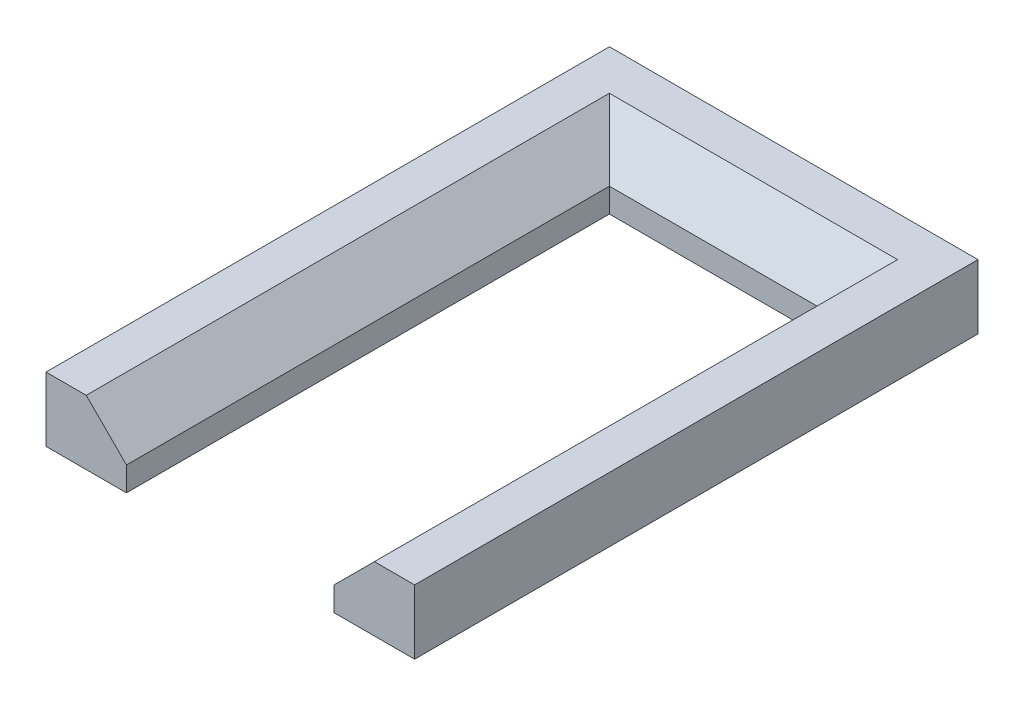
ISO-10303-21;
HEADER;
FILE_DESCRIPTION(('STEP AP214'),'2;1');
FILE_NAME('part.step','',(''),(''),'','','');
FILE_SCHEMA(('AUTOMOTIVE_DESIGN { 1 0 10303 214 1 1 1 1 }'));
ENDSEC;
DATA;
#1=APPLICATION_CONTEXT('core data for automotive mechanical design processes');
#2=APPLICATION_PROTOCOL_DEFINITION('international standard','automotive_design',2000,#1);
#3=PRODUCT_CONTEXT('',#1,'mechanical');
#4=PRODUCT('Part','Part','',(#3));
#5=PRODUCT_RELATED_PRODUCT_CATEGORY('part','',(#4));
#6=PRODUCT_DEFINITION_FORMATION('','',#4);
#7=PRODUCT_DEFINITION_CONTEXT('part definition',#1,'design');
#8=PRODUCT_DEFINITION('design','',#6,#7);
#9=PRODUCT_DEFINITION_SHAPE('','',#8);
#10=(LENGTH_UNIT() NAMED_UNIT(*) SI_UNIT(.MILLI.,.METRE.));
#11=(NAMED_UNIT(*) PLANE_ANGLE_UNIT() SI_UNIT($,.RADIAN.));
#12=(NAMED_UNIT(*) SI_UNIT($,.STERADIAN.) SOLID_ANGLE_UNIT());
#13=UNCERTAINTY_MEASURE_WITH_UNIT(LENGTH_MEASURE(1.E-05),#10,'distance_accuracy_value','');
#14=(GEOMETRIC_REPRESENTATION_CONTEXT(3) GLOBAL_UNCERTAINTY_ASSIGNED_CONTEXT((#13)) GLOBAL_UNIT_ASSIGNED_CONTEXT((#10,
#11,#12)) REPRESENTATION_CONTEXT('',''));
#15=CARTESIAN_POINT('',(0.,0.,0.));
#16=DIRECTION('',(0.,0.,1.));
#17=DIRECTION('',(1.,0.,0.));
#18=AXIS2_PLACEMENT_3D('',#15,#16,#17);
#19=CARTESIAN_POINT('',(-22.9,8.,-70.));
#20=DIRECTION('',(1.,0.,0.));
#21=DIRECTION('',(0.,0.,-1.));
#22=AXIS2_PLACEMENT_3D('',#19,#20,#21);
#23=PLANE('',#22);
#24=DIRECTION('',(0.,0.,1.));
#25=VECTOR('',#24,1.);
#26=CARTESIAN_POINT('',(-22.9,0.,-70.));
#27=LINE('',#26,#25);
#28=CARTESIAN_POINT('',(-22.9,0.,-70.));
#29=VERTEX_POINT('',#28);
#30=CARTESIAN_POINT('',(-22.9,0.,0.));
#31=VERTEX_POINT('',#30);
#32=EDGE_CURVE('E139',#29,#31,#27,.T.);
#33=ORIENTED_EDGE('',*,*,#32,.T.);
#34=DIRECTION('',(0.,-1.,0.));
#35=VECTOR('',#34,1.);
#36=CARTESIAN_POINT('',(-22.9,8.,0.));
#37=LINE('',#36,#35);
#38=CARTESIAN_POINT('',(-22.9,8.,0.));
#39=VERTEX_POINT('',#38);
#40=EDGE_CURVE('E119',#39,#31,#37,.T.);
#41=ORIENTED_EDGE('',*,*,#40,.F.);
#42=DIRECTION('',(0.,0.,1.));
#43=VECTOR('',#42,1.);
#44=CARTESIAN_POINT('',(-22.9,8.,-70.));
#45=LINE('',#44,#43);
#46=CARTESIAN_POINT('',(-22.9,8.,-70.));
#47=VERTEX_POINT('',#46);
#48=EDGE_CURVE('E127',#47,#39,#45,.T.);
#49=ORIENTED_EDGE('',*,*,#48,.F.);
#50=DIRECTION('',(0.,-1.,0.));
#51=VECTOR('',#50,1.);
#52=CARTESIAN_POINT('',(-22.9,8.,-70.));
#53=LINE('',#52,#51);
#54=EDGE_CURVE('E186',#47,#29,#53,.T.);
#55=ORIENTED_EDGE('',*,*,#54,.T.);
#56=EDGE_LOOP('',(#33,#41,#49,#55));
#57=FACE_BOUND('',#56,.T.);
#58=ADVANCED_FACE('F35',(#57),#23,.F.);
#59=CARTESIAN_POINT('',(-22.9,8.,0.));
#60=DIRECTION('',(0.,0.,-1.));
#61=DIRECTION('',(-1.,0.,0.));
#62=AXIS2_PLACEMENT_3D('',#59,#60,#61);
#63=PLANE('',#62);
#64=DIRECTION('',(0.,-1.,0.));
#65=VECTOR('',#64,1.);
#66=CARTESIAN_POINT('',(-12.9,8.,0.));
#67=LINE('',#66,#65);
#68=CARTESIAN_POINT('',(-12.9,2.99999999999999,0.));
#69=VERTEX_POINT('',#68);
#70=CARTESIAN_POINT('',(-12.9,0.,0.));
#71=VERTEX_POINT('',#70);
#72=EDGE_CURVE('E141',#69,#71,#67,.T.);
#73=ORIENTED_EDGE('',*,*,#72,.F.);
#74=DIRECTION('',(-0.707106781186546,0.707106781186549,0.));
#75=VECTOR('',#74,1.);
#76=CARTESIAN_POINT('',(-17.9,8.,0.));
#77=LINE('',#76,#75);
#78=CARTESIAN_POINT('',(-17.9,8.,0.));
#79=VERTEX_POINT('',#78);
#80=EDGE_CURVE('E122',#69,#79,#77,.T.);
#81=ORIENTED_EDGE('',*,*,#80,.T.);
#82=DIRECTION('',(1.,0.,0.));
#83=VECTOR('',#82,1.);
#84=CARTESIAN_POINT('',(-22.9,8.,0.));
#85=LINE('',#84,#83);
#86=EDGE_CURVE('E113',#39,#79,#85,.T.);
#87=ORIENTED_EDGE('',*,*,#86,.F.);
#88=ORIENTED_EDGE('',*,*,#40,.T.);
#89=DIRECTION('',(1.,0.,0.));
#90=VECTOR('',#89,1.);
#91=CARTESIAN_POINT('',(-22.9,0.,0.));
#92=LINE('',#91,#90);
#93=EDGE_CURVE('E166',#31,#71,#92,.T.);
#94=ORIENTED_EDGE('',*,*,#93,.T.);
#95=EDGE_LOOP('',(#73,#81,#87,#88,#94));
#96=FACE_BOUND('',#95,.T.);
#97=ADVANCED_FACE('F116',(#96),#63,.F.);
#98=CARTESIAN_POINT('',(-12.9,8.,0.));
#99=DIRECTION('',(-1.,0.,0.));
#100=DIRECTION('',(0.,0.,1.));
#101=AXIS2_PLACEMENT_3D('',#98,#99,#100);
#102=PLANE('',#101);
#103=DIRECTION('',(0.,-1.,0.));
#104=VECTOR('',#103,1.);
#105=CARTESIAN_POINT('',(-12.9,8.,-60.));
#106=LINE('',#105,#104);
#107=CARTESIAN_POINT('',(-12.9,2.99999999999999,-60.));
#108=VERTEX_POINT('',#107);
#109=CARTESIAN_POINT('',(-12.9,0.,-60.));
#110=VERTEX_POINT('',#109);
#111=EDGE_CURVE('E145',#108,#110,#106,.T.);
#112=ORIENTED_EDGE('',*,*,#111,.F.);
#113=DIRECTION('',(0.,0.,1.));
#114=VECTOR('',#113,1.);
#115=CARTESIAN_POINT('',(-12.9,2.99999999999999,0.));
#116=LINE('',#115,#114);
#117=EDGE_CURVE('E152',#108,#69,#116,.T.);
#118=ORIENTED_EDGE('',*,*,#117,.T.);
#119=ORIENTED_EDGE('',*,*,#72,.T.);
#120=DIRECTION('',(0.,0.,-1.));
#121=VECTOR('',#120,1.);
#122=CARTESIAN_POINT('',(-12.9,0.,0.));
#123=LINE('',#122,#121);
#124=EDGE_CURVE('E168',#71,#110,#123,.T.);
#125=ORIENTED_EDGE('',*,*,#124,.T.);
#126=EDGE_LOOP('',(#112,#118,#119,#125));
#127=FACE_BOUND('',#126,.T.);
#128=ADVANCED_FACE('F204',(#127),#102,.F.);
#129=CARTESIAN_POINT('',(-12.9,8.,-60.));
#130=DIRECTION('',(0.,0.,-1.));
#131=DIRECTION('',(-1.,0.,0.));
#132=AXIS2_PLACEMENT_3D('',#129,#130,#131);
#133=PLANE('',#132);
#134=DIRECTION('',(0.,-1.,0.));
#135=VECTOR('',#134,1.);
#136=CARTESIAN_POINT('',(12.9,8.,-60.));
#137=LINE('',#136,#135);
#138=CARTESIAN_POINT('',(12.9,2.99999999999999,-60.));
#139=VERTEX_POINT('',#138);
#140=CARTESIAN_POINT('',(12.9,0.,-60.));
#141=VERTEX_POINT('',#140);
#142=EDGE_CURVE('E196',#139,#141,#137,.T.);
#143=ORIENTED_EDGE('',*,*,#142,.F.);
#144=DIRECTION('',(-1.,0.,0.));
#145=VECTOR('',#144,1.);
#146=CARTESIAN_POINT('',(-12.9,2.99999999999999,-60.));
#147=LINE('',#146,#145);
#148=EDGE_CURVE('E155',#139,#108,#147,.T.);
#149=ORIENTED_EDGE('',*,*,#148,.T.);
#150=ORIENTED_EDGE('',*,*,#111,.T.);
#151=DIRECTION('',(1.,0.,0.));
#152=VECTOR('',#151,1.);
#153=CARTESIAN_POINT('',(-12.9,0.,-60.));
#154=LINE('',#153,#152);
#155=EDGE_CURVE('E175',#110,#141,#154,.T.);
#156=ORIENTED_EDGE('',*,*,#155,.T.);
#157=EDGE_LOOP('',(#143,#149,#150,#156));
#158=FACE_BOUND('',#157,.T.);
#159=ADVANCED_FACE('F199',(#158),#133,.F.);
#160=CARTESIAN_POINT('',(12.9,8.,-60.));
#161=DIRECTION('',(1.,0.,0.));
#162=DIRECTION('',(0.,0.,-1.));
#163=AXIS2_PLACEMENT_3D('',#160,#161,#162);
#164=PLANE('',#163);
#165=DIRECTION('',(0.,-1.,0.));
#166=VECTOR('',#165,1.);
#167=CARTESIAN_POINT('',(12.9,8.,0.));
#168=LINE('',#167,#166);
#169=CARTESIAN_POINT('',(12.9,2.99999999999999,0.));
#170=VERTEX_POINT('',#169);
#171=CARTESIAN_POINT('',(12.9,0.,0.));
#172=VERTEX_POINT('',#171);
#173=EDGE_CURVE('E194',#170,#172,#168,.T.);
#174=ORIENTED_EDGE('',*,*,#173,.F.);
#175=DIRECTION('',(0.,0.,-1.));
#176=VECTOR('',#175,1.);
#177=CARTESIAN_POINT('',(12.9,2.99999999999999,-60.));
#178=LINE('',#177,#176);
#179=EDGE_CURVE('E11',#170,#139,#178,.T.);
#180=ORIENTED_EDGE('',*,*,#179,.T.);
#181=ORIENTED_EDGE('',*,*,#142,.T.);
#182=DIRECTION('',(0.,0.,1.));
#183=VECTOR('',#182,1.);
#184=CARTESIAN_POINT('',(12.9,0.,-60.));
#185=LINE('',#184,#183);
#186=EDGE_CURVE('E178',#141,#172,#185,.T.);
#187=ORIENTED_EDGE('',*,*,#186,.T.);
#188=EDGE_LOOP('',(#174,#180,#181,#187));
#189=FACE_BOUND('',#188,.T.);
#190=ADVANCED_FACE('F209',(#189),#164,.F.);
#191=CARTESIAN_POINT('',(12.9,8.,0.));
#192=DIRECTION('',(0.,0.,-1.));
#193=DIRECTION('',(-1.,0.,0.));
#194=AXIS2_PLACEMENT_3D('',#191,#192,#193);
#195=PLANE('',#194);
#196=DIRECTION('',(1.,0.,0.));
#197=VECTOR('',#196,1.);
#198=CARTESIAN_POINT('',(12.9,8.,0.));
#199=LINE('',#198,#197);
#200=CARTESIAN_POINT('',(17.9,8.,0.));
#201=VERTEX_POINT('',#200);
#202=CARTESIAN_POINT('',(22.9,8.,0.));
#203=VERTEX_POINT('',#202);
#204=EDGE_CURVE('E126',#201,#203,#199,.T.);
#205=ORIENTED_EDGE('',*,*,#204,.F.);
#206=DIRECTION('',(-0.707106781186546,-0.707106781186549,0.));
#207=VECTOR('',#206,1.);
#208=CARTESIAN_POINT('',(17.9,8.,0.));
#209=LINE('',#208,#207);
#210=EDGE_CURVE('E45',#201,#170,#209,.T.);
#211=ORIENTED_EDGE('',*,*,#210,.T.);
#212=ORIENTED_EDGE('',*,*,#173,.T.);
#213=DIRECTION('',(1.,0.,0.));
#214=VECTOR('',#213,1.);
#215=CARTESIAN_POINT('',(12.9,0.,0.));
#216=LINE('',#215,#214);
#217=CARTESIAN_POINT('',(22.9,0.,0.));
#218=VERTEX_POINT('',#217);
#219=EDGE_CURVE('E181',#172,#218,#216,.T.);
#220=ORIENTED_EDGE('',*,*,#219,.T.);
#221=DIRECTION('',(0.,-1.,0.));
#222=VECTOR('',#221,1.);
#223=CARTESIAN_POINT('',(22.9,8.,0.));
#224=LINE('',#223,#222);
#225=EDGE_CURVE('E191',#203,#218,#224,.T.);
#226=ORIENTED_EDGE('',*,*,#225,.F.);
#227=EDGE_LOOP('',(#205,#211,#212,#220,#226));
#228=FACE_BOUND('',#227,.T.);
#229=ADVANCED_FACE('F223',(#228),#195,.F.);
#230=CARTESIAN_POINT('',(22.9,8.,0.));
#231=DIRECTION('',(-1.,0.,0.));
#232=DIRECTION('',(0.,0.,1.));
#233=AXIS2_PLACEMENT_3D('',#230,#231,#232);
#234=PLANE('',#233);
#235=DIRECTION('',(0.,0.,-1.));
#236=VECTOR('',#235,1.);
#237=CARTESIAN_POINT('',(22.9,0.,0.));
#238=LINE('',#237,#236);
#239=CARTESIAN_POINT('',(22.9,0.,-70.));
#240=VERTEX_POINT('',#239);
#241=EDGE_CURVE('E183',#218,#240,#238,.T.);
#242=ORIENTED_EDGE('',*,*,#241,.T.);
#243=DIRECTION('',(0.,-1.,0.));
#244=VECTOR('',#243,1.);
#245=CARTESIAN_POINT('',(22.9,8.,-70.));
#246=LINE('',#245,#244);
#247=CARTESIAN_POINT('',(22.9,8.,-70.));
#248=VERTEX_POINT('',#247);
#249=EDGE_CURVE('E188',#248,#240,#246,.T.);
#250=ORIENTED_EDGE('',*,*,#249,.F.);
#251=DIRECTION('',(0.,0.,-1.));
#252=VECTOR('',#251,1.);
#253=CARTESIAN_POINT('',(22.9,8.,0.));
#254=LINE('',#253,#252);
#255=EDGE_CURVE('E221',#203,#248,#254,.T.);
#256=ORIENTED_EDGE('',*,*,#255,.F.);
#257=ORIENTED_EDGE('',*,*,#225,.T.);
#258=EDGE_LOOP('',(#242,#250,#256,#257));
#259=FACE_BOUND('',#258,.T.);
#260=ADVANCED_FACE('F220',(#259),#234,.F.);
#261=CARTESIAN_POINT('',(22.9,8.,-70.));
#262=DIRECTION('',(0.,0.,1.));
#263=DIRECTION('',(1.,0.,0.));
#264=AXIS2_PLACEMENT_3D('',#261,#262,#263);
#265=PLANE('',#264);
#266=DIRECTION('',(-1.,0.,0.));
#267=VECTOR('',#266,1.);
#268=CARTESIAN_POINT('',(22.9,0.,-70.));
#269=LINE('',#268,#267);
#270=EDGE_CURVE('E136',#240,#29,#269,.T.);
#271=ORIENTED_EDGE('',*,*,#270,.T.);
#272=ORIENTED_EDGE('',*,*,#54,.F.);
#273=DIRECTION('',(-1.,0.,0.));
#274=VECTOR('',#273,1.);
#275=CARTESIAN_POINT('',(22.9,8.,-70.));
#276=LINE('',#275,#274);
#277=EDGE_CURVE('E132',#248,#47,#276,.T.);
#278=ORIENTED_EDGE('',*,*,#277,.F.);
#279=ORIENTED_EDGE('',*,*,#249,.T.);
#280=EDGE_LOOP('',(#271,#272,#278,#279));
#281=FACE_BOUND('',#280,.T.);
#282=ADVANCED_FACE('F216',(#281),#265,.F.);
#283=CARTESIAN_POINT('',(0.,8.,0.));
#284=DIRECTION('',(0.,1.,0.));
#285=DIRECTION('',(0.,0.,1.));
#286=AXIS2_PLACEMENT_3D('',#283,#284,#285);
#287=PLANE('',#286);
#288=ORIENTED_EDGE('',*,*,#86,.T.);
#289=DIRECTION('',(0.,0.,-1.));
#290=VECTOR('',#289,1.);
#291=CARTESIAN_POINT('',(-17.9,8.,-60.));
#292=LINE('',#291,#290);
#293=CARTESIAN_POINT('',(-17.9,8.,-65.));
#294=VERTEX_POINT('',#293);
#295=EDGE_CURVE('E150',#79,#294,#292,.T.);
#296=ORIENTED_EDGE('',*,*,#295,.T.);
#297=DIRECTION('',(1.,0.,0.));
#298=VECTOR('',#297,1.);
#299=CARTESIAN_POINT('',(12.9,8.,-65.));
#300=LINE('',#299,#298);
#301=CARTESIAN_POINT('',(17.9,8.,-65.));
#302=VERTEX_POINT('',#301);
#303=EDGE_CURVE('E143',#294,#302,#300,.T.);
#304=ORIENTED_EDGE('',*,*,#303,.T.);
#305=DIRECTION('',(0.,0.,1.));
#306=VECTOR('',#305,1.);
#307=CARTESIAN_POINT('',(17.9,8.,0.));
#308=LINE('',#307,#306);
#309=EDGE_CURVE('E140',#302,#201,#308,.T.);
#310=ORIENTED_EDGE('',*,*,#309,.T.);
#311=ORIENTED_EDGE('',*,*,#204,.T.);
#312=ORIENTED_EDGE('',*,*,#255,.T.);
#313=ORIENTED_EDGE('',*,*,#277,.T.);
#314=ORIENTED_EDGE('',*,*,#48,.T.);
#315=EDGE_LOOP('',(#288,#296,#304,#310,#311,#312,#313,#314));
#316=FACE_BOUND('',#315,.T.);
#317=ADVANCED_FACE('F130',(#316),#287,.T.);
#318=CARTESIAN_POINT('',(0.,0.,0.));
#319=DIRECTION('',(0.,1.,0.));
#320=DIRECTION('',(0.,0.,1.));
#321=AXIS2_PLACEMENT_3D('',#318,#319,#320);
#322=PLANE('',#321);
#323=ORIENTED_EDGE('',*,*,#32,.F.);
#324=ORIENTED_EDGE('',*,*,#270,.F.);
#325=ORIENTED_EDGE('',*,*,#241,.F.);
#326=ORIENTED_EDGE('',*,*,#219,.F.);
#327=ORIENTED_EDGE('',*,*,#186,.F.);
#328=ORIENTED_EDGE('',*,*,#155,.F.);
#329=ORIENTED_EDGE('',*,*,#124,.F.);
#330=ORIENTED_EDGE('',*,*,#93,.F.);
#331=EDGE_LOOP('',(#323,#324,#325,#326,#327,#328,#329,#330));
#332=FACE_BOUND('',#331,.T.);
#333=ADVANCED_FACE('F206',(#332),#322,.F.);
#334=CARTESIAN_POINT('',(17.9,8.,0.));
#335=DIRECTION('',(-0.707106781186549,0.707106781186546,0.));
#336=DIRECTION('',(0.,0.,-1.));
#337=AXIS2_PLACEMENT_3D('',#334,#335,#336);
#338=PLANE('',#337);
#339=ORIENTED_EDGE('',*,*,#210,.F.);
#340=ORIENTED_EDGE('',*,*,#309,.F.);
#341=DIRECTION('',(-0.577350269189625,-0.577350269189627,0.577350269189625));
#342=VECTOR('',#341,1.);
#343=CARTESIAN_POINT('',(11.9333333333333,2.03333333333333,-59.0333333333333));
#344=LINE('',#343,#342);
#345=EDGE_CURVE('E40',#139,#302,#344,.F.);
#346=ORIENTED_EDGE('',*,*,#345,.F.);
#347=ORIENTED_EDGE('',*,*,#179,.F.);
#348=EDGE_LOOP('',(#339,#340,#346,#347));
#349=FACE_BOUND('',#348,.T.);
#350=ADVANCED_FACE('F38',(#349),#338,.T.);
#351=CARTESIAN_POINT('',(0.,8.,-65.));
#352=DIRECTION('',(0.,0.707106781186546,0.707106781186549));
#353=DIRECTION('',(-1.,0.,0.));
#354=AXIS2_PLACEMENT_3D('',#351,#352,#353);
#355=PLANE('',#354);
#356=ORIENTED_EDGE('',*,*,#345,.T.);
#357=ORIENTED_EDGE('',*,*,#303,.F.);
#358=DIRECTION('',(0.577350269189625,-0.577350269189627,0.577350269189625));
#359=VECTOR('',#358,1.);
#360=CARTESIAN_POINT('',(3.7666666666666,-13.6666666666667,-43.3333333333334));
#361=LINE('',#360,#359);
#362=EDGE_CURVE('E157',#108,#294,#361,.F.);
#363=ORIENTED_EDGE('',*,*,#362,.F.);
#364=ORIENTED_EDGE('',*,*,#148,.F.);
#365=EDGE_LOOP('',(#356,#357,#363,#364));
#366=FACE_BOUND('',#365,.T.);
#367=ADVANCED_FACE('F212',(#366),#355,.T.);
#368=CARTESIAN_POINT('',(-17.9,8.,0.));
#369=DIRECTION('',(0.707106781186549,0.707106781186546,0.));
#370=DIRECTION('',(0.,0.,1.));
#371=AXIS2_PLACEMENT_3D('',#368,#369,#370);
#372=PLANE('',#371);
#373=ORIENTED_EDGE('',*,*,#80,.F.);
#374=ORIENTED_EDGE('',*,*,#117,.F.);
#375=ORIENTED_EDGE('',*,*,#362,.T.);
#376=ORIENTED_EDGE('',*,*,#295,.F.);
#377=EDGE_LOOP('',(#373,#374,#375,#376));
#378=FACE_BOUND('',#377,.T.);
#379=ADVANCED_FACE('F213',(#378),#372,.T.);
#380=CLOSED_SHELL('',(#58,#97,#128,#159,#190,#229,#260,#282,#317,#333,#350,#367,#379));
#381=MANIFOLD_SOLID_BREP('B2',#380);
#382=ADVANCED_BREP_SHAPE_REPRESENTATION('',(#18,#381),#14);
#383=SHAPE_DEFINITION_REPRESENTATION(#9,#382);
ENDSEC;
END-ISO-10303-21;
